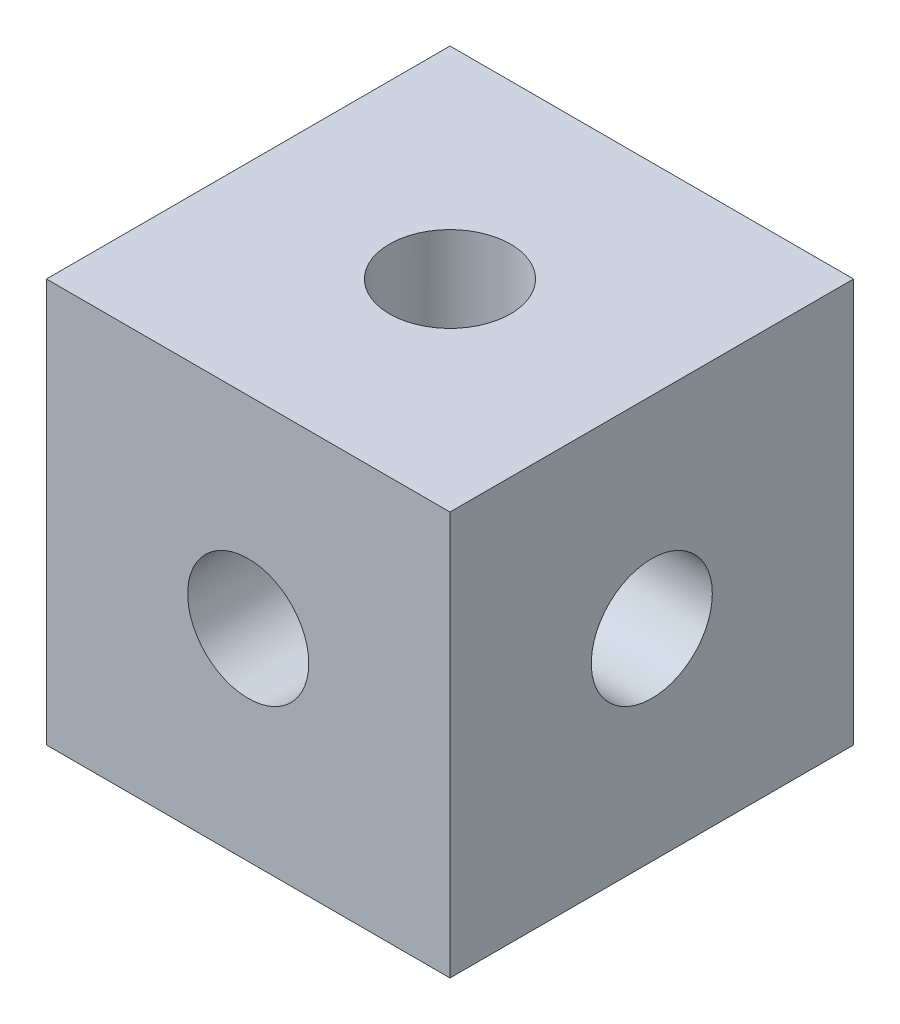
ISO-10303-21;
HEADER;
FILE_DESCRIPTION(('STEP AP214'),'2;1');
FILE_NAME('part.step','',(''),(''),'','','');
FILE_SCHEMA(('AUTOMOTIVE_DESIGN { 1 0 10303 214 1 1 1 1 }'));
ENDSEC;
DATA;
#1=APPLICATION_CONTEXT('core data for automotive mechanical design processes');
#2=APPLICATION_PROTOCOL_DEFINITION('international standard','automotive_design',2000,#1);
#3=PRODUCT_CONTEXT('',#1,'mechanical');
#4=PRODUCT('Part','Part','',(#3));
#5=PRODUCT_RELATED_PRODUCT_CATEGORY('part','',(#4));
#6=PRODUCT_DEFINITION_FORMATION('','',#4);
#7=PRODUCT_DEFINITION_CONTEXT('part definition',#1,'design');
#8=PRODUCT_DEFINITION('design','',#6,#7);
#9=PRODUCT_DEFINITION_SHAPE('','',#8);
#10=(LENGTH_UNIT() NAMED_UNIT(*) SI_UNIT(.MILLI.,.METRE.));
#11=(NAMED_UNIT(*) PLANE_ANGLE_UNIT() SI_UNIT($,.RADIAN.));
#12=(NAMED_UNIT(*) SI_UNIT($,.STERADIAN.) SOLID_ANGLE_UNIT());
#13=UNCERTAINTY_MEASURE_WITH_UNIT(LENGTH_MEASURE(1.E-05),#10,'distance_accuracy_value','');
#14=(GEOMETRIC_REPRESENTATION_CONTEXT(3) GLOBAL_UNCERTAINTY_ASSIGNED_CONTEXT((#13)) GLOBAL_UNIT_ASSIGNED_CONTEXT((#10,
#11,#12)) REPRESENTATION_CONTEXT('',''));
#15=CARTESIAN_POINT('',(0.,0.,0.));
#16=DIRECTION('',(0.,0.,1.));
#17=DIRECTION('',(1.,0.,0.));
#18=AXIS2_PLACEMENT_3D('',#15,#16,#17);
#19=CARTESIAN_POINT('',(0.,10.,0.));
#20=DIRECTION('',(0.,-1.,0.));
#21=DIRECTION('',(0.,0.,-1.));
#22=AXIS2_PLACEMENT_3D('',#19,#20,#21);
#23=CYLINDRICAL_SURFACE('',#22,1.5);
#24=CARTESIAN_POINT('',(0.,5.,0.));
#25=DIRECTION('',(0.,-0.707106781186547,0.707106781186547));
#26=DIRECTION('',(0.,-0.707106781186547,-0.707106781186547));
#27=AXIS2_PLACEMENT_3D('',#24,#25,#26);
#28=ELLIPSE('',#27,2.12132034355964,1.5);
#29=CARTESIAN_POINT('',(-1.06066017177982,6.06066017177982,1.06066017177982));
#30=VERTEX_POINT('',#29);
#31=CARTESIAN_POINT('',(1.06066017177982,6.06066017177982,1.06066017177982));
#32=VERTEX_POINT('',#31);
#33=EDGE_CURVE('E56',#30,#32,#28,.F.);
#34=ORIENTED_EDGE('',*,*,#33,.F.);
#35=CARTESIAN_POINT('',(0.,5.,0.));
#36=DIRECTION('',(-0.707106781186547,-0.707106781186547,0.));
#37=DIRECTION('',(0.707106781186547,-0.707106781186547,0.));
#38=AXIS2_PLACEMENT_3D('',#35,#36,#37);
#39=ELLIPSE('',#38,2.12132034355964,1.5);
#40=CARTESIAN_POINT('',(-1.06066017177982,6.06066017177982,-1.06066017177982));
#41=VERTEX_POINT('',#40);
#42=EDGE_CURVE('E116',#41,#30,#39,.F.);
#43=ORIENTED_EDGE('',*,*,#42,.F.);
#44=CARTESIAN_POINT('',(0.,5.,0.));
#45=DIRECTION('',(0.,-0.707106781186547,-0.707106781186547));
#46=DIRECTION('',(0.,-0.707106781186547,0.707106781186547));
#47=AXIS2_PLACEMENT_3D('',#44,#45,#46);
#48=ELLIPSE('',#47,2.12132034355964,1.5);
#49=CARTESIAN_POINT('',(1.06066017177982,6.06066017177982,-1.06066017177982));
#50=VERTEX_POINT('',#49);
#51=EDGE_CURVE('E128',#50,#41,#48,.F.);
#52=ORIENTED_EDGE('',*,*,#51,.F.);
#53=CARTESIAN_POINT('',(0.,5.,0.));
#54=DIRECTION('',(0.707106781186547,-0.707106781186547,0.));
#55=DIRECTION('',(-0.707106781186547,-0.707106781186547,0.));
#56=AXIS2_PLACEMENT_3D('',#53,#54,#55);
#57=ELLIPSE('',#56,2.12132034355964,1.5);
#58=EDGE_CURVE('E103',#32,#50,#57,.F.);
#59=ORIENTED_EDGE('',*,*,#58,.F.);
#60=EDGE_LOOP('',(#34,#43,#52,#59));
#61=FACE_BOUND('',#60,.T.);
#62=CARTESIAN_POINT('',(0.,10.,0.));
#63=DIRECTION('',(0.,1.,0.));
#64=DIRECTION('',(0.,0.,1.));
#65=AXIS2_PLACEMENT_3D('',#62,#63,#64);
#66=CIRCLE('',#65,1.5);
#67=CARTESIAN_POINT('',(0.,10.,1.5));
#68=VERTEX_POINT('',#67);
#69=EDGE_CURVE('E144',#68,#68,#66,.T.);
#70=ORIENTED_EDGE('',*,*,#69,.T.);
#71=EDGE_LOOP('',(#70));
#72=FACE_BOUND('',#71,.T.);
#73=ADVANCED_FACE('F34',(#61,#72),#23,.F.);
#74=CARTESIAN_POINT('',(0.,10.,0.));
#75=DIRECTION('',(0.,-1.,0.));
#76=DIRECTION('',(0.,0.,-1.));
#77=AXIS2_PLACEMENT_3D('',#74,#75,#76);
#78=PLANE('',#77);
#79=DIRECTION('',(0.,0.,-1.));
#80=VECTOR('',#79,1.);
#81=CARTESIAN_POINT('',(5.,10.,5.));
#82=LINE('',#81,#80);
#83=CARTESIAN_POINT('',(5.,10.,5.));
#84=VERTEX_POINT('',#83);
#85=CARTESIAN_POINT('',(5.,10.,-5.));
#86=VERTEX_POINT('',#85);
#87=EDGE_CURVE('E150',#84,#86,#82,.T.);
#88=ORIENTED_EDGE('',*,*,#87,.T.);
#89=DIRECTION('',(-1.,0.,0.));
#90=VECTOR('',#89,1.);
#91=CARTESIAN_POINT('',(-5.,10.,-5.));
#92=LINE('',#91,#90);
#93=CARTESIAN_POINT('',(-5.,10.,-5.));
#94=VERTEX_POINT('',#93);
#95=EDGE_CURVE('E153',#86,#94,#92,.T.);
#96=ORIENTED_EDGE('',*,*,#95,.T.);
#97=DIRECTION('',(0.,0.,1.));
#98=VECTOR('',#97,1.);
#99=CARTESIAN_POINT('',(-5.,10.,5.));
#100=LINE('',#99,#98);
#101=CARTESIAN_POINT('',(-5.,10.,5.));
#102=VERTEX_POINT('',#101);
#103=EDGE_CURVE('E156',#94,#102,#100,.T.);
#104=ORIENTED_EDGE('',*,*,#103,.T.);
#105=DIRECTION('',(1.,0.,0.));
#106=VECTOR('',#105,1.);
#107=CARTESIAN_POINT('',(-5.,10.,5.));
#108=LINE('',#107,#106);
#109=EDGE_CURVE('E158',#102,#84,#108,.T.);
#110=ORIENTED_EDGE('',*,*,#109,.T.);
#111=EDGE_LOOP('',(#88,#96,#104,#110));
#112=FACE_BOUND('',#111,.T.);
#113=ORIENTED_EDGE('',*,*,#69,.F.);
#114=EDGE_LOOP('',(#113));
#115=FACE_BOUND('',#114,.T.);
#116=ADVANCED_FACE('F197',(#112,#115),#78,.F.);
#117=CARTESIAN_POINT('',(0.,0.,0.));
#118=DIRECTION('',(0.,-1.,0.));
#119=DIRECTION('',(0.,0.,-1.));
#120=AXIS2_PLACEMENT_3D('',#117,#118,#119);
#121=PLANE('',#120);
#122=DIRECTION('',(0.,0.,-1.));
#123=VECTOR('',#122,1.);
#124=CARTESIAN_POINT('',(5.,0.,5.));
#125=LINE('',#124,#123);
#126=CARTESIAN_POINT('',(5.,0.,5.));
#127=VERTEX_POINT('',#126);
#128=CARTESIAN_POINT('',(5.,0.,-5.));
#129=VERTEX_POINT('',#128);
#130=EDGE_CURVE('E147',#127,#129,#125,.T.);
#131=ORIENTED_EDGE('',*,*,#130,.F.);
#132=DIRECTION('',(1.,0.,0.));
#133=VECTOR('',#132,1.);
#134=CARTESIAN_POINT('',(-5.,0.,5.));
#135=LINE('',#134,#133);
#136=CARTESIAN_POINT('',(-5.,0.,5.));
#137=VERTEX_POINT('',#136);
#138=EDGE_CURVE('E154',#137,#127,#135,.T.);
#139=ORIENTED_EDGE('',*,*,#138,.F.);
#140=DIRECTION('',(0.,0.,1.));
#141=VECTOR('',#140,1.);
#142=CARTESIAN_POINT('',(-5.,0.,5.));
#143=LINE('',#142,#141);
#144=CARTESIAN_POINT('',(-5.,0.,-5.));
#145=VERTEX_POINT('',#144);
#146=EDGE_CURVE('E165',#145,#137,#143,.T.);
#147=ORIENTED_EDGE('',*,*,#146,.F.);
#148=DIRECTION('',(-1.,0.,0.));
#149=VECTOR('',#148,1.);
#150=CARTESIAN_POINT('',(-5.,0.,-5.));
#151=LINE('',#150,#149);
#152=EDGE_CURVE('E163',#129,#145,#151,.T.);
#153=ORIENTED_EDGE('',*,*,#152,.F.);
#154=EDGE_LOOP('',(#131,#139,#147,#153));
#155=FACE_BOUND('',#154,.T.);
#156=CARTESIAN_POINT('',(0.,0.,0.));
#157=DIRECTION('',(0.,1.,0.));
#158=DIRECTION('',(0.,0.,1.));
#159=AXIS2_PLACEMENT_3D('',#156,#157,#158);
#160=CIRCLE('',#159,1.5);
#161=CARTESIAN_POINT('',(0.,0.,1.5));
#162=VERTEX_POINT('',#161);
#163=EDGE_CURVE('E141',#162,#162,#160,.T.);
#164=ORIENTED_EDGE('',*,*,#163,.T.);
#165=EDGE_LOOP('',(#164));
#166=FACE_BOUND('',#165,.T.);
#167=ADVANCED_FACE('F186',(#155,#166),#121,.T.);
#168=CARTESIAN_POINT('',(5.,10.,5.));
#169=DIRECTION('',(-1.,0.,0.));
#170=DIRECTION('',(0.,0.,1.));
#171=AXIS2_PLACEMENT_3D('',#168,#169,#170);
#172=PLANE('',#171);
#173=CARTESIAN_POINT('',(5.,5.,0.));
#174=DIRECTION('',(1.,0.,0.));
#175=DIRECTION('',(0.,0.,-1.));
#176=AXIS2_PLACEMENT_3D('',#173,#174,#175);
#177=CIRCLE('',#176,1.5);
#178=CARTESIAN_POINT('',(5.,5.,-1.5));
#179=VERTEX_POINT('',#178);
#180=EDGE_CURVE('E132',#179,#179,#177,.T.);
#181=ORIENTED_EDGE('',*,*,#180,.F.);
#182=EDGE_LOOP('',(#181));
#183=FACE_BOUND('',#182,.T.);
#184=ORIENTED_EDGE('',*,*,#130,.T.);
#185=DIRECTION('',(0.,-1.,0.));
#186=VECTOR('',#185,1.);
#187=CARTESIAN_POINT('',(5.,10.,-5.));
#188=LINE('',#187,#186);
#189=EDGE_CURVE('E120',#86,#129,#188,.T.);
#190=ORIENTED_EDGE('',*,*,#189,.F.);
#191=ORIENTED_EDGE('',*,*,#87,.F.);
#192=DIRECTION('',(0.,-1.,0.));
#193=VECTOR('',#192,1.);
#194=CARTESIAN_POINT('',(5.,10.,5.));
#195=LINE('',#194,#193);
#196=EDGE_CURVE('E160',#84,#127,#195,.T.);
#197=ORIENTED_EDGE('',*,*,#196,.T.);
#198=EDGE_LOOP('',(#184,#190,#191,#197));
#199=FACE_BOUND('',#198,.T.);
#200=ADVANCED_FACE('F36',(#183,#199),#172,.F.);
#201=CARTESIAN_POINT('',(-5.,10.,-5.));
#202=DIRECTION('',(0.,0.,1.));
#203=DIRECTION('',(1.,0.,0.));
#204=AXIS2_PLACEMENT_3D('',#201,#202,#203);
#205=PLANE('',#204);
#206=CARTESIAN_POINT('',(0.,5.,-5.));
#207=DIRECTION('',(0.,0.,1.));
#208=DIRECTION('',(1.,0.,0.));
#209=AXIS2_PLACEMENT_3D('',#206,#207,#208);
#210=CIRCLE('',#209,1.5);
#211=CARTESIAN_POINT('',(1.5,5.,-5.));
#212=VERTEX_POINT('',#211);
#213=EDGE_CURVE('E112',#212,#212,#210,.T.);
#214=ORIENTED_EDGE('',*,*,#213,.T.);
#215=EDGE_LOOP('',(#214));
#216=FACE_BOUND('',#215,.T.);
#217=ORIENTED_EDGE('',*,*,#152,.T.);
#218=DIRECTION('',(0.,-1.,0.));
#219=VECTOR('',#218,1.);
#220=CARTESIAN_POINT('',(-5.,10.,-5.));
#221=LINE('',#220,#219);
#222=EDGE_CURVE('E173',#94,#145,#221,.T.);
#223=ORIENTED_EDGE('',*,*,#222,.F.);
#224=ORIENTED_EDGE('',*,*,#95,.F.);
#225=ORIENTED_EDGE('',*,*,#189,.T.);
#226=EDGE_LOOP('',(#217,#223,#224,#225));
#227=FACE_BOUND('',#226,.T.);
#228=ADVANCED_FACE('F178',(#216,#227),#205,.F.);
#229=CARTESIAN_POINT('',(-5.,10.,5.));
#230=DIRECTION('',(1.,0.,0.));
#231=DIRECTION('',(0.,0.,-1.));
#232=AXIS2_PLACEMENT_3D('',#229,#230,#231);
#233=PLANE('',#232);
#234=CARTESIAN_POINT('',(-5.,5.,0.));
#235=DIRECTION('',(1.,0.,0.));
#236=DIRECTION('',(0.,0.,-1.));
#237=AXIS2_PLACEMENT_3D('',#234,#235,#236);
#238=CIRCLE('',#237,1.5);
#239=CARTESIAN_POINT('',(-5.,5.,-1.5));
#240=VERTEX_POINT('',#239);
#241=EDGE_CURVE('E138',#240,#240,#238,.T.);
#242=ORIENTED_EDGE('',*,*,#241,.T.);
#243=EDGE_LOOP('',(#242));
#244=FACE_BOUND('',#243,.T.);
#245=ORIENTED_EDGE('',*,*,#146,.T.);
#246=DIRECTION('',(0.,-1.,0.));
#247=VECTOR('',#246,1.);
#248=CARTESIAN_POINT('',(-5.,10.,5.));
#249=LINE('',#248,#247);
#250=EDGE_CURVE('E170',#102,#137,#249,.T.);
#251=ORIENTED_EDGE('',*,*,#250,.F.);
#252=ORIENTED_EDGE('',*,*,#103,.F.);
#253=ORIENTED_EDGE('',*,*,#222,.T.);
#254=EDGE_LOOP('',(#245,#251,#252,#253));
#255=FACE_BOUND('',#254,.T.);
#256=ADVANCED_FACE('F191',(#244,#255),#233,.F.);
#257=CARTESIAN_POINT('',(-5.,10.,5.));
#258=DIRECTION('',(0.,0.,-1.));
#259=DIRECTION('',(-1.,0.,0.));
#260=AXIS2_PLACEMENT_3D('',#257,#258,#259);
#261=PLANE('',#260);
#262=CARTESIAN_POINT('',(0.,5.,5.));
#263=DIRECTION('',(0.,0.,1.));
#264=DIRECTION('',(1.,0.,0.));
#265=AXIS2_PLACEMENT_3D('',#262,#263,#264);
#266=CIRCLE('',#265,1.5);
#267=CARTESIAN_POINT('',(1.5,5.,5.));
#268=VERTEX_POINT('',#267);
#269=EDGE_CURVE('E232',#268,#268,#266,.T.);
#270=ORIENTED_EDGE('',*,*,#269,.F.);
#271=EDGE_LOOP('',(#270));
#272=FACE_BOUND('',#271,.T.);
#273=ORIENTED_EDGE('',*,*,#138,.T.);
#274=ORIENTED_EDGE('',*,*,#196,.F.);
#275=ORIENTED_EDGE('',*,*,#109,.F.);
#276=ORIENTED_EDGE('',*,*,#250,.T.);
#277=EDGE_LOOP('',(#273,#274,#275,#276));
#278=FACE_BOUND('',#277,.T.);
#279=ADVANCED_FACE('F195',(#272,#278),#261,.F.);
#280=CARTESIAN_POINT('',(0.,5.,0.));
#281=DIRECTION('',(0.,-0.707106781186547,0.707106781186547));
#282=DIRECTION('',(0.,-0.707106781186547,-0.707106781186547));
#283=AXIS2_PLACEMENT_3D('',#280,#281,#282);
#284=ELLIPSE('',#283,2.12132034355964,1.5);
#285=CARTESIAN_POINT('',(-1.06066017177982,3.93933982822018,-1.06066017177982));
#286=VERTEX_POINT('',#285);
#287=CARTESIAN_POINT('',(1.06066017177982,3.93933982822018,-1.06066017177982));
#288=VERTEX_POINT('',#287);
#289=EDGE_CURVE('E49',#286,#288,#284,.T.);
#290=ORIENTED_EDGE('',*,*,#289,.F.);
#291=CARTESIAN_POINT('',(0.,5.,0.));
#292=DIRECTION('',(0.707106781186547,-0.707106781186547,0.));
#293=DIRECTION('',(-0.707106781186547,-0.707106781186547,0.));
#294=AXIS2_PLACEMENT_3D('',#291,#292,#293);
#295=ELLIPSE('',#294,2.12132034355964,1.5);
#296=CARTESIAN_POINT('',(-1.06066017177982,3.93933982822018,1.06066017177982));
#297=VERTEX_POINT('',#296);
#298=EDGE_CURVE('E111',#297,#286,#295,.T.);
#299=ORIENTED_EDGE('',*,*,#298,.F.);
#300=CARTESIAN_POINT('',(0.,5.,0.));
#301=DIRECTION('',(0.,-0.707106781186547,-0.707106781186547));
#302=DIRECTION('',(0.,-0.707106781186547,0.707106781186547));
#303=AXIS2_PLACEMENT_3D('',#300,#301,#302);
#304=ELLIPSE('',#303,2.12132034355964,1.5);
#305=CARTESIAN_POINT('',(1.06066017177982,3.93933982822018,1.06066017177982));
#306=VERTEX_POINT('',#305);
#307=EDGE_CURVE('E97',#306,#297,#304,.T.);
#308=ORIENTED_EDGE('',*,*,#307,.F.);
#309=CARTESIAN_POINT('',(0.,5.,0.));
#310=DIRECTION('',(-0.707106781186547,-0.707106781186547,0.));
#311=DIRECTION('',(0.707106781186547,-0.707106781186547,0.));
#312=AXIS2_PLACEMENT_3D('',#309,#310,#311);
#313=ELLIPSE('',#312,2.12132034355964,1.5);
#314=EDGE_CURVE('E109',#288,#306,#313,.T.);
#315=ORIENTED_EDGE('',*,*,#314,.F.);
#316=EDGE_LOOP('',(#290,#299,#308,#315));
#317=FACE_BOUND('',#316,.T.);
#318=ORIENTED_EDGE('',*,*,#163,.F.);
#319=EDGE_LOOP('',(#318));
#320=FACE_BOUND('',#319,.T.);
#321=ADVANCED_FACE('F107',(#317,#320),#23,.F.);
#322=CARTESIAN_POINT('',(-5.,5.,0.));
#323=DIRECTION('',(1.,0.,0.));
#324=DIRECTION('',(0.,0.,-1.));
#325=AXIS2_PLACEMENT_3D('',#322,#323,#324);
#326=CYLINDRICAL_SURFACE('',#325,1.5);
#327=ORIENTED_EDGE('',*,*,#42,.T.);
#328=CARTESIAN_POINT('',(0.,5.,0.));
#329=DIRECTION('',(0.707106781186547,0.,0.707106781186547));
#330=DIRECTION('',(0.707106781186547,0.,-0.707106781186547));
#331=AXIS2_PLACEMENT_3D('',#328,#329,#330);
#332=ELLIPSE('',#331,2.12132034355964,1.5);
#333=EDGE_CURVE('E134',#30,#297,#332,.T.);
#334=ORIENTED_EDGE('',*,*,#333,.T.);
#335=ORIENTED_EDGE('',*,*,#298,.T.);
#336=CARTESIAN_POINT('',(0.,5.,0.));
#337=DIRECTION('',(0.707106781186547,0.,-0.707106781186547));
#338=DIRECTION('',(0.707106781186547,0.,0.707106781186547));
#339=AXIS2_PLACEMENT_3D('',#336,#337,#338);
#340=ELLIPSE('',#339,2.12132034355964,1.5);
#341=EDGE_CURVE('E130',#286,#41,#340,.T.);
#342=ORIENTED_EDGE('',*,*,#341,.T.);
#343=EDGE_LOOP('',(#327,#334,#335,#342));
#344=FACE_BOUND('',#343,.T.);
#345=ORIENTED_EDGE('',*,*,#241,.F.);
#346=EDGE_LOOP('',(#345));
#347=FACE_BOUND('',#346,.T.);
#348=ADVANCED_FACE('F208',(#344,#347),#326,.F.);
#349=ORIENTED_EDGE('',*,*,#58,.T.);
#350=CARTESIAN_POINT('',(0.,5.,0.));
#351=DIRECTION('',(0.707106781186547,0.,0.707106781186547));
#352=DIRECTION('',(0.707106781186547,0.,-0.707106781186547));
#353=AXIS2_PLACEMENT_3D('',#350,#351,#352);
#354=ELLIPSE('',#353,2.12132034355964,1.5);
#355=EDGE_CURVE('E11',#50,#288,#354,.F.);
#356=ORIENTED_EDGE('',*,*,#355,.T.);
#357=ORIENTED_EDGE('',*,*,#314,.T.);
#358=CARTESIAN_POINT('',(0.,5.,0.));
#359=DIRECTION('',(0.707106781186547,0.,-0.707106781186547));
#360=DIRECTION('',(0.707106781186547,0.,0.707106781186547));
#361=AXIS2_PLACEMENT_3D('',#358,#359,#360);
#362=ELLIPSE('',#361,2.12132034355964,1.5);
#363=EDGE_CURVE('E42',#306,#32,#362,.F.);
#364=ORIENTED_EDGE('',*,*,#363,.T.);
#365=EDGE_LOOP('',(#349,#356,#357,#364));
#366=FACE_BOUND('',#365,.T.);
#367=ORIENTED_EDGE('',*,*,#180,.T.);
#368=EDGE_LOOP('',(#367));
#369=FACE_BOUND('',#368,.T.);
#370=ADVANCED_FACE('F114',(#366,#369),#326,.F.);
#371=CARTESIAN_POINT('',(0.,5.,-5.));
#372=DIRECTION('',(0.,0.,1.));
#373=DIRECTION('',(1.,0.,0.));
#374=AXIS2_PLACEMENT_3D('',#371,#372,#373);
#375=CYLINDRICAL_SURFACE('',#374,1.5);
#376=ORIENTED_EDGE('',*,*,#269,.T.);
#377=EDGE_LOOP('',(#376));
#378=FACE_BOUND('',#377,.T.);
#379=ORIENTED_EDGE('',*,*,#33,.T.);
#380=ORIENTED_EDGE('',*,*,#363,.F.);
#381=ORIENTED_EDGE('',*,*,#307,.T.);
#382=ORIENTED_EDGE('',*,*,#333,.F.);
#383=EDGE_LOOP('',(#379,#380,#381,#382));
#384=FACE_BOUND('',#383,.T.);
#385=ADVANCED_FACE('F96',(#378,#384),#375,.F.);
#386=ORIENTED_EDGE('',*,*,#213,.F.);
#387=EDGE_LOOP('',(#386));
#388=FACE_BOUND('',#387,.T.);
#389=ORIENTED_EDGE('',*,*,#289,.T.);
#390=ORIENTED_EDGE('',*,*,#355,.F.);
#391=ORIENTED_EDGE('',*,*,#51,.T.);
#392=ORIENTED_EDGE('',*,*,#341,.F.);
#393=EDGE_LOOP('',(#389,#390,#391,#392));
#394=FACE_BOUND('',#393,.T.);
#395=ADVANCED_FACE('F238',(#388,#394),#375,.F.);
#396=CLOSED_SHELL('',(#73,#116,#167,#200,#228,#256,#279,#321,#348,#370,#385,#395));
#397=MANIFOLD_SOLID_BREP('B2',#396);
#398=ADVANCED_BREP_SHAPE_REPRESENTATION('',(#18,#397),#14);
#399=SHAPE_DEFINITION_REPRESENTATION(#9,#398);
ENDSEC;
END-ISO-10303-21;
